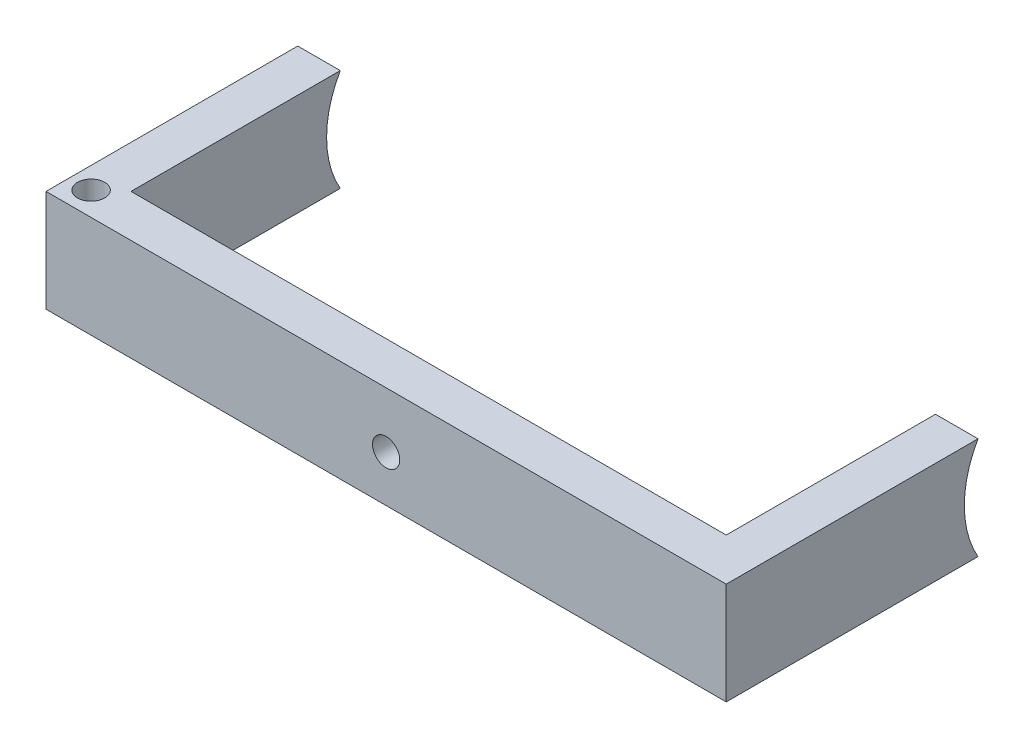
ISO-10303-21;
HEADER;
FILE_DESCRIPTION(('STEP AP214'),'2;1');
FILE_NAME('part.step','',(''),(''),'','','');
FILE_SCHEMA(('AUTOMOTIVE_DESIGN { 1 0 10303 214 1 1 1 1 }'));
ENDSEC;
DATA;
#1=APPLICATION_CONTEXT('core data for automotive mechanical design processes');
#2=APPLICATION_PROTOCOL_DEFINITION('international standard','automotive_design',2000,#1);
#3=PRODUCT_CONTEXT('',#1,'mechanical');
#4=PRODUCT('Part','Part','',(#3));
#5=PRODUCT_RELATED_PRODUCT_CATEGORY('part','',(#4));
#6=PRODUCT_DEFINITION_FORMATION('','',#4);
#7=PRODUCT_DEFINITION_CONTEXT('part definition',#1,'design');
#8=PRODUCT_DEFINITION('design','',#6,#7);
#9=PRODUCT_DEFINITION_SHAPE('','',#8);
#10=(LENGTH_UNIT() NAMED_UNIT(*) SI_UNIT(.MILLI.,.METRE.));
#11=(NAMED_UNIT(*) PLANE_ANGLE_UNIT() SI_UNIT($,.RADIAN.));
#12=(NAMED_UNIT(*) SI_UNIT($,.STERADIAN.) SOLID_ANGLE_UNIT());
#13=UNCERTAINTY_MEASURE_WITH_UNIT(LENGTH_MEASURE(1.E-05),#10,'distance_accuracy_value','');
#14=(GEOMETRIC_REPRESENTATION_CONTEXT(3) GLOBAL_UNCERTAINTY_ASSIGNED_CONTEXT((#13)) GLOBAL_UNIT_ASSIGNED_CONTEXT((#10,
#11,#12)) REPRESENTATION_CONTEXT('',''));
#15=CARTESIAN_POINT('',(0.,0.,0.));
#16=DIRECTION('',(0.,0.,1.));
#17=DIRECTION('',(1.,0.,0.));
#18=AXIS2_PLACEMENT_3D('',#15,#16,#17);
#19=CARTESIAN_POINT('',(730.393772202578,15.,0.));
#20=DIRECTION('',(-1.,0.,0.));
#21=DIRECTION('',(0.,0.,1.));
#22=AXIS2_PLACEMENT_3D('',#19,#20,#21);
#23=CYLINDRICAL_SURFACE('',#22,30.);
#24=DIRECTION('',(1.,0.,0.));
#25=VECTOR('',#24,1.);
#26=CARTESIAN_POINT('',(-101.,0.,25.9807621135332));
#27=LINE('',#26,#25);
#28=CARTESIAN_POINT('',(87.5000000000002,0.,25.9807621135331));
#29=VERTEX_POINT('',#28);
#30=CARTESIAN_POINT('',(100.,0.,25.9807621135332));
#31=VERTEX_POINT('',#30);
#32=EDGE_CURVE('E88',#29,#31,#27,.T.);
#33=ORIENTED_EDGE('',*,*,#32,.F.);
#34=CARTESIAN_POINT('',(87.5,15.,0.));
#35=DIRECTION('',(1.,0.,0.));
#36=DIRECTION('',(0.,0.,-1.));
#37=AXIS2_PLACEMENT_3D('',#34,#35,#36);
#38=CIRCLE('',#37,30.);
#39=CARTESIAN_POINT('',(87.5000000000002,30.,25.9807621135332));
#40=VERTEX_POINT('',#39);
#41=EDGE_CURVE('E138',#29,#40,#38,.F.);
#42=ORIENTED_EDGE('',*,*,#41,.T.);
#43=DIRECTION('',(1.,0.,0.));
#44=VECTOR('',#43,1.);
#45=CARTESIAN_POINT('',(-101.,30.,25.9807621135332));
#46=LINE('',#45,#44);
#47=CARTESIAN_POINT('',(100.,30.,25.9807621135331));
#48=VERTEX_POINT('',#47);
#49=EDGE_CURVE('E128',#40,#48,#46,.T.);
#50=ORIENTED_EDGE('',*,*,#49,.T.);
#51=CARTESIAN_POINT('',(100.,15.,0.));
#52=DIRECTION('',(-1.,0.,0.));
#53=DIRECTION('',(0.,0.,1.));
#54=AXIS2_PLACEMENT_3D('',#51,#52,#53);
#55=CIRCLE('',#54,30.);
#56=EDGE_CURVE('E51',#31,#48,#55,.T.);
#57=ORIENTED_EDGE('',*,*,#56,.F.);
#58=EDGE_LOOP('',(#33,#42,#50,#57));
#59=FACE_BOUND('',#58,.T.);
#60=ADVANCED_FACE('F35',(#59),#23,.F.);
#61=CARTESIAN_POINT('',(87.5,0.,87.5));
#62=DIRECTION('',(1.,0.,0.));
#63=DIRECTION('',(0.,0.,-1.));
#64=AXIS2_PLACEMENT_3D('',#61,#62,#63);
#65=PLANE('',#64);
#66=ORIENTED_EDGE('',*,*,#41,.F.);
#67=DIRECTION('',(0.,0.,-1.));
#68=VECTOR('',#67,1.);
#69=CARTESIAN_POINT('',(87.5,0.,87.5));
#70=LINE('',#69,#68);
#71=CARTESIAN_POINT('',(87.5,0.,87.5));
#72=VERTEX_POINT('',#71);
#73=EDGE_CURVE('E106',#72,#29,#70,.T.);
#74=ORIENTED_EDGE('',*,*,#73,.F.);
#75=DIRECTION('',(0.,1.,0.));
#76=VECTOR('',#75,1.);
#77=CARTESIAN_POINT('',(87.5,0.,87.5));
#78=LINE('',#77,#76);
#79=CARTESIAN_POINT('',(87.5,30.,87.5));
#80=VERTEX_POINT('',#79);
#81=EDGE_CURVE('E89',#72,#80,#78,.T.);
#82=ORIENTED_EDGE('',*,*,#81,.T.);
#83=DIRECTION('',(0.,0.,-1.));
#84=VECTOR('',#83,1.);
#85=CARTESIAN_POINT('',(87.5,30.,87.5));
#86=LINE('',#85,#84);
#87=EDGE_CURVE('E110',#80,#40,#86,.T.);
#88=ORIENTED_EDGE('',*,*,#87,.T.);
#89=EDGE_LOOP('',(#66,#74,#82,#88));
#90=FACE_BOUND('',#89,.T.);
#91=ADVANCED_FACE('F177',(#90),#65,.F.);
#92=CARTESIAN_POINT('',(-87.5,0.,87.5));
#93=DIRECTION('',(-1.,0.,0.));
#94=DIRECTION('',(0.,0.,1.));
#95=AXIS2_PLACEMENT_3D('',#92,#93,#94);
#96=PLANE('',#95);
#97=CARTESIAN_POINT('',(-87.5,15.,0.));
#98=DIRECTION('',(-1.,0.,0.));
#99=DIRECTION('',(0.,0.,1.));
#100=AXIS2_PLACEMENT_3D('',#97,#98,#99);
#101=CIRCLE('',#100,30.);
#102=CARTESIAN_POINT('',(-87.5,30.,25.9807621135331));
#103=VERTEX_POINT('',#102);
#104=CARTESIAN_POINT('',(-87.5,0.,25.9807621135331));
#105=VERTEX_POINT('',#104);
#106=EDGE_CURVE('E141',#103,#105,#101,.F.);
#107=ORIENTED_EDGE('',*,*,#106,.F.);
#108=DIRECTION('',(0.,0.,1.));
#109=VECTOR('',#108,1.);
#110=CARTESIAN_POINT('',(-87.5,30.,87.5));
#111=LINE('',#110,#109);
#112=CARTESIAN_POINT('',(-87.5,30.,87.5));
#113=VERTEX_POINT('',#112);
#114=EDGE_CURVE('E107',#103,#113,#111,.T.);
#115=ORIENTED_EDGE('',*,*,#114,.T.);
#116=DIRECTION('',(0.,1.,0.));
#117=VECTOR('',#116,1.);
#118=CARTESIAN_POINT('',(-87.5,0.,87.5));
#119=LINE('',#118,#117);
#120=CARTESIAN_POINT('',(-87.5,0.,87.5));
#121=VERTEX_POINT('',#120);
#122=EDGE_CURVE('E93',#121,#113,#119,.T.);
#123=ORIENTED_EDGE('',*,*,#122,.F.);
#124=DIRECTION('',(0.,0.,1.));
#125=VECTOR('',#124,1.);
#126=CARTESIAN_POINT('',(-87.5,0.,87.5));
#127=LINE('',#126,#125);
#128=EDGE_CURVE('E115',#105,#121,#127,.T.);
#129=ORIENTED_EDGE('',*,*,#128,.F.);
#130=EDGE_LOOP('',(#107,#115,#123,#129));
#131=FACE_BOUND('',#130,.T.);
#132=ADVANCED_FACE('F161',(#131),#96,.F.);
#133=CARTESIAN_POINT('',(100.,30.,-100.));
#134=DIRECTION('',(-1.,0.,0.));
#135=DIRECTION('',(0.,0.,1.));
#136=AXIS2_PLACEMENT_3D('',#133,#134,#135);
#137=PLANE('',#136);
#138=ORIENTED_EDGE('',*,*,#56,.T.);
#139=DIRECTION('',(0.,0.,-1.));
#140=VECTOR('',#139,1.);
#141=CARTESIAN_POINT('',(100.,30.,-100.));
#142=LINE('',#141,#140);
#143=CARTESIAN_POINT('',(100.,30.,100.));
#144=VERTEX_POINT('',#143);
#145=EDGE_CURVE('E78',#144,#48,#142,.T.);
#146=ORIENTED_EDGE('',*,*,#145,.F.);
#147=DIRECTION('',(0.,-1.,0.));
#148=VECTOR('',#147,1.);
#149=CARTESIAN_POINT('',(100.,30.,100.));
#150=LINE('',#149,#148);
#151=CARTESIAN_POINT('',(100.,0.,100.));
#152=VERTEX_POINT('',#151);
#153=EDGE_CURVE('E44',#144,#152,#150,.T.);
#154=ORIENTED_EDGE('',*,*,#153,.T.);
#155=DIRECTION('',(0.,0.,-1.));
#156=VECTOR('',#155,1.);
#157=CARTESIAN_POINT('',(100.,0.,-100.));
#158=LINE('',#157,#156);
#159=EDGE_CURVE('E82',#152,#31,#158,.T.);
#160=ORIENTED_EDGE('',*,*,#159,.T.);
#161=EDGE_LOOP('',(#138,#146,#154,#160));
#162=FACE_BOUND('',#161,.T.);
#163=ADVANCED_FACE('F37',(#162),#137,.F.);
#164=CARTESIAN_POINT('',(0.,13.6147395955971,-150.5));
#165=DIRECTION('',(0.,0.,1.));
#166=DIRECTION('',(1.,0.,0.));
#167=AXIS2_PLACEMENT_3D('',#164,#165,#166);
#168=CYLINDRICAL_SURFACE('',#167,4.);
#169=CARTESIAN_POINT('',(0.,13.6147395955971,100.));
#170=DIRECTION('',(0.,0.,1.));
#171=DIRECTION('',(1.,0.,0.));
#172=AXIS2_PLACEMENT_3D('',#169,#170,#171);
#173=CIRCLE('',#172,4.);
#174=CARTESIAN_POINT('',(4.,13.6147395955971,100.));
#175=VERTEX_POINT('',#174);
#176=EDGE_CURVE('E125',#175,#175,#173,.T.);
#177=ORIENTED_EDGE('',*,*,#176,.T.);
#178=EDGE_LOOP('',(#177));
#179=FACE_BOUND('',#178,.T.);
#180=CARTESIAN_POINT('',(0.,13.6147395955971,87.5));
#181=DIRECTION('',(0.,0.,1.));
#182=DIRECTION('',(1.,0.,0.));
#183=AXIS2_PLACEMENT_3D('',#180,#181,#182);
#184=CIRCLE('',#183,4.);
#185=CARTESIAN_POINT('',(4.,13.6147395955971,87.5));
#186=VERTEX_POINT('',#185);
#187=EDGE_CURVE('E122',#186,#186,#184,.T.);
#188=ORIENTED_EDGE('',*,*,#187,.F.);
#189=EDGE_LOOP('',(#188));
#190=FACE_BOUND('',#189,.T.);
#191=ADVANCED_FACE('F202',(#179,#190),#168,.F.);
#192=CARTESIAN_POINT('',(-87.5,0.,87.5));
#193=DIRECTION('',(0.,0.,1.));
#194=DIRECTION('',(1.,0.,0.));
#195=AXIS2_PLACEMENT_3D('',#192,#193,#194);
#196=PLANE('',#195);
#197=ORIENTED_EDGE('',*,*,#187,.T.);
#198=EDGE_LOOP('',(#197));
#199=FACE_BOUND('',#198,.T.);
#200=DIRECTION('',(1.,0.,0.));
#201=VECTOR('',#200,1.);
#202=CARTESIAN_POINT('',(-87.5,30.,87.5));
#203=LINE('',#202,#201);
#204=EDGE_CURVE('E103',#113,#80,#203,.T.);
#205=ORIENTED_EDGE('',*,*,#204,.T.);
#206=ORIENTED_EDGE('',*,*,#81,.F.);
#207=DIRECTION('',(1.,0.,0.));
#208=VECTOR('',#207,1.);
#209=CARTESIAN_POINT('',(-87.5,0.,87.5));
#210=LINE('',#209,#208);
#211=EDGE_CURVE('E101',#121,#72,#210,.T.);
#212=ORIENTED_EDGE('',*,*,#211,.F.);
#213=ORIENTED_EDGE('',*,*,#122,.T.);
#214=EDGE_LOOP('',(#205,#206,#212,#213));
#215=FACE_BOUND('',#214,.T.);
#216=ADVANCED_FACE('F169',(#199,#215),#196,.F.);
#217=CARTESIAN_POINT('',(-100.,30.,-100.));
#218=DIRECTION('',(1.,0.,0.));
#219=DIRECTION('',(0.,0.,-1.));
#220=AXIS2_PLACEMENT_3D('',#217,#218,#219);
#221=PLANE('',#220);
#222=DIRECTION('',(0.,0.,1.));
#223=VECTOR('',#222,1.);
#224=CARTESIAN_POINT('',(-100.,30.,-100.));
#225=LINE('',#224,#223);
#226=CARTESIAN_POINT('',(-100.,30.,25.9807621135331));
#227=VERTEX_POINT('',#226);
#228=CARTESIAN_POINT('',(-100.,30.,100.));
#229=VERTEX_POINT('',#228);
#230=EDGE_CURVE('E97',#227,#229,#225,.T.);
#231=ORIENTED_EDGE('',*,*,#230,.F.);
#232=CARTESIAN_POINT('',(-100.,15.,0.));
#233=DIRECTION('',(1.,0.,0.));
#234=DIRECTION('',(0.,0.,-1.));
#235=AXIS2_PLACEMENT_3D('',#232,#233,#234);
#236=CIRCLE('',#235,30.);
#237=CARTESIAN_POINT('',(-100.,0.,25.9807621135332));
#238=VERTEX_POINT('',#237);
#239=EDGE_CURVE('E129',#227,#238,#236,.T.);
#240=ORIENTED_EDGE('',*,*,#239,.T.);
#241=DIRECTION('',(0.,0.,1.));
#242=VECTOR('',#241,1.);
#243=CARTESIAN_POINT('',(-100.,0.,-100.));
#244=LINE('',#243,#242);
#245=CARTESIAN_POINT('',(-100.,0.,100.));
#246=VERTEX_POINT('',#245);
#247=EDGE_CURVE('E79',#238,#246,#244,.T.);
#248=ORIENTED_EDGE('',*,*,#247,.T.);
#249=DIRECTION('',(0.,-1.,0.));
#250=VECTOR('',#249,1.);
#251=CARTESIAN_POINT('',(-100.,30.,100.));
#252=LINE('',#251,#250);
#253=EDGE_CURVE('E11',#229,#246,#252,.T.);
#254=ORIENTED_EDGE('',*,*,#253,.F.);
#255=EDGE_LOOP('',(#231,#240,#248,#254));
#256=FACE_BOUND('',#255,.T.);
#257=ADVANCED_FACE('F191',(#256),#221,.F.);
#258=CARTESIAN_POINT('',(-93.6945215497768,-201.,93.0455013493783));
#259=DIRECTION('',(0.,1.,0.));
#260=DIRECTION('',(0.,0.,1.));
#261=AXIS2_PLACEMENT_3D('',#258,#259,#260);
#262=CYLINDRICAL_SURFACE('',#261,4.00000000000001);
#263=CARTESIAN_POINT('',(-93.6945215497768,30.,93.0455013493783));
#264=DIRECTION('',(0.,1.,0.));
#265=DIRECTION('',(0.,0.,1.));
#266=AXIS2_PLACEMENT_3D('',#263,#264,#265);
#267=CIRCLE('',#266,4.00000000000001);
#268=CARTESIAN_POINT('',(-93.6945215497768,30.,97.0455013493783));
#269=VERTEX_POINT('',#268);
#270=EDGE_CURVE('E119',#269,#269,#267,.T.);
#271=ORIENTED_EDGE('',*,*,#270,.T.);
#272=EDGE_LOOP('',(#271));
#273=FACE_BOUND('',#272,.T.);
#274=CARTESIAN_POINT('',(-93.6945215497768,0.,93.0455013493783));
#275=DIRECTION('',(0.,1.,0.));
#276=DIRECTION('',(0.,0.,1.));
#277=AXIS2_PLACEMENT_3D('',#274,#275,#276);
#278=CIRCLE('',#277,4.00000000000001);
#279=CARTESIAN_POINT('',(-93.6945215497768,0.,97.0455013493783));
#280=VERTEX_POINT('',#279);
#281=EDGE_CURVE('E39',#280,#280,#278,.T.);
#282=ORIENTED_EDGE('',*,*,#281,.F.);
#283=EDGE_LOOP('',(#282));
#284=FACE_BOUND('',#283,.T.);
#285=ADVANCED_FACE('F193',(#273,#284),#262,.F.);
#286=CARTESIAN_POINT('',(-100.,30.,100.));
#287=DIRECTION('',(0.,0.,-1.));
#288=DIRECTION('',(-1.,0.,0.));
#289=AXIS2_PLACEMENT_3D('',#286,#287,#288);
#290=PLANE('',#289);
#291=ORIENTED_EDGE('',*,*,#176,.F.);
#292=EDGE_LOOP('',(#291));
#293=FACE_BOUND('',#292,.T.);
#294=DIRECTION('',(1.,0.,0.));
#295=VECTOR('',#294,1.);
#296=CARTESIAN_POINT('',(-100.,0.,100.));
#297=LINE('',#296,#295);
#298=EDGE_CURVE('E71',#246,#152,#297,.T.);
#299=ORIENTED_EDGE('',*,*,#298,.T.);
#300=ORIENTED_EDGE('',*,*,#153,.F.);
#301=DIRECTION('',(1.,0.,0.));
#302=VECTOR('',#301,1.);
#303=CARTESIAN_POINT('',(-100.,30.,100.));
#304=LINE('',#303,#302);
#305=EDGE_CURVE('E59',#229,#144,#304,.T.);
#306=ORIENTED_EDGE('',*,*,#305,.F.);
#307=ORIENTED_EDGE('',*,*,#253,.T.);
#308=EDGE_LOOP('',(#299,#300,#306,#307));
#309=FACE_BOUND('',#308,.T.);
#310=ADVANCED_FACE('F73',(#293,#309),#290,.F.);
#311=CARTESIAN_POINT('',(0.,30.,0.));
#312=DIRECTION('',(0.,1.,0.));
#313=DIRECTION('',(0.,0.,1.));
#314=AXIS2_PLACEMENT_3D('',#311,#312,#313);
#315=PLANE('',#314);
#316=EDGE_CURVE('E132',#227,#103,#46,.T.);
#317=ORIENTED_EDGE('',*,*,#316,.F.);
#318=ORIENTED_EDGE('',*,*,#230,.T.);
#319=ORIENTED_EDGE('',*,*,#305,.T.);
#320=ORIENTED_EDGE('',*,*,#145,.T.);
#321=ORIENTED_EDGE('',*,*,#49,.F.);
#322=ORIENTED_EDGE('',*,*,#87,.F.);
#323=ORIENTED_EDGE('',*,*,#204,.F.);
#324=ORIENTED_EDGE('',*,*,#114,.F.);
#325=EDGE_LOOP('',(#317,#318,#319,#320,#321,#322,#323,#324));
#326=FACE_BOUND('',#325,.T.);
#327=ORIENTED_EDGE('',*,*,#270,.F.);
#328=EDGE_LOOP('',(#327));
#329=FACE_BOUND('',#328,.T.);
#330=ADVANCED_FACE('F180',(#326,#329),#315,.T.);
#331=CARTESIAN_POINT('',(0.,0.,0.));
#332=DIRECTION('',(0.,1.,0.));
#333=DIRECTION('',(0.,0.,1.));
#334=AXIS2_PLACEMENT_3D('',#331,#332,#333);
#335=PLANE('',#334);
#336=ORIENTED_EDGE('',*,*,#281,.T.);
#337=EDGE_LOOP('',(#336));
#338=FACE_BOUND('',#337,.T.);
#339=ORIENTED_EDGE('',*,*,#247,.F.);
#340=EDGE_CURVE('E135',#238,#105,#27,.T.);
#341=ORIENTED_EDGE('',*,*,#340,.T.);
#342=ORIENTED_EDGE('',*,*,#128,.T.);
#343=ORIENTED_EDGE('',*,*,#211,.T.);
#344=ORIENTED_EDGE('',*,*,#73,.T.);
#345=ORIENTED_EDGE('',*,*,#32,.T.);
#346=ORIENTED_EDGE('',*,*,#159,.F.);
#347=ORIENTED_EDGE('',*,*,#298,.F.);
#348=EDGE_LOOP('',(#339,#341,#342,#343,#344,#345,#346,#347));
#349=FACE_BOUND('',#348,.T.);
#350=ADVANCED_FACE('F85',(#338,#349),#335,.F.);
#351=ORIENTED_EDGE('',*,*,#316,.T.);
#352=ORIENTED_EDGE('',*,*,#106,.T.);
#353=ORIENTED_EDGE('',*,*,#340,.F.);
#354=ORIENTED_EDGE('',*,*,#239,.F.);
#355=EDGE_LOOP('',(#351,#352,#353,#354));
#356=FACE_BOUND('',#355,.T.);
#357=ADVANCED_FACE('F148',(#356),#23,.F.);
#358=CLOSED_SHELL('',(#60,#91,#132,#163,#191,#216,#257,#285,#310,#330,#350,#357));
#359=MANIFOLD_SOLID_BREP('B2',#358);
#360=ADVANCED_BREP_SHAPE_REPRESENTATION('',(#18,#359),#14);
#361=SHAPE_DEFINITION_REPRESENTATION(#9,#360);
ENDSEC;
END-ISO-10303-21;
